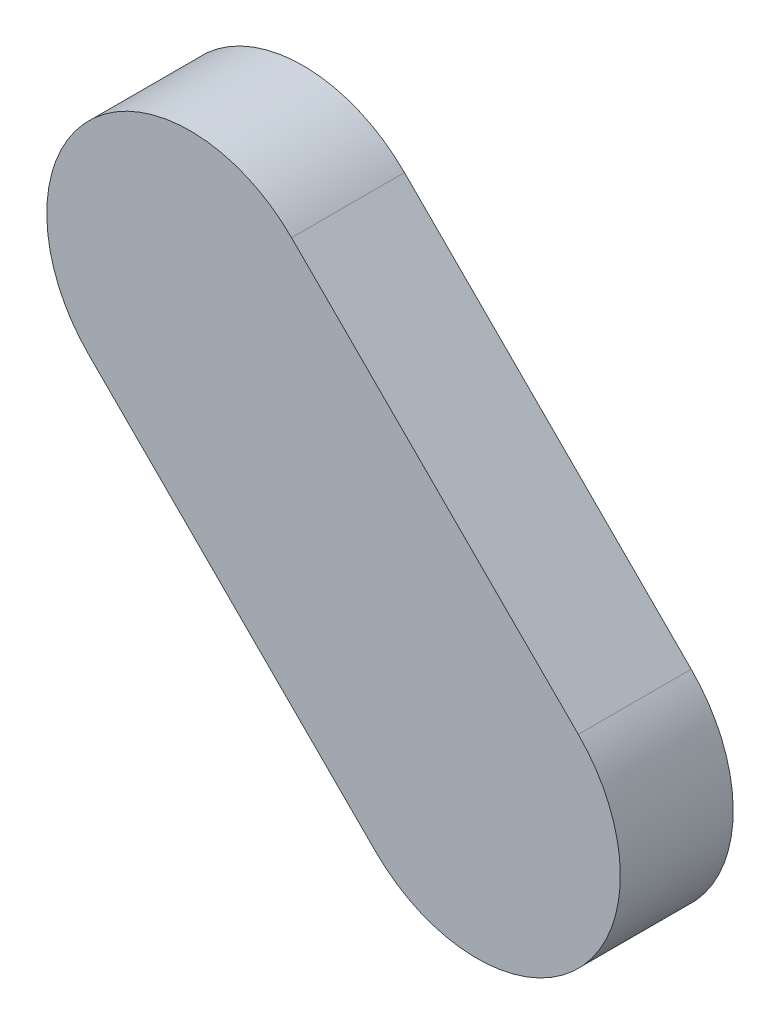
ISO-10303-21;
HEADER;
FILE_DESCRIPTION(('STEP AP214'),'2;1');
FILE_NAME('part.step','',(''),(''),'','','');
FILE_SCHEMA(('AUTOMOTIVE_DESIGN { 1 0 10303 214 1 1 1 1 }'));
ENDSEC;
DATA;
#1=APPLICATION_CONTEXT('core data for automotive mechanical design processes');
#2=APPLICATION_PROTOCOL_DEFINITION('international standard','automotive_design',2000,#1);
#3=PRODUCT_CONTEXT('',#1,'mechanical');
#4=PRODUCT('Part','Part','',(#3));
#5=PRODUCT_RELATED_PRODUCT_CATEGORY('part','',(#4));
#6=PRODUCT_DEFINITION_FORMATION('','',#4);
#7=PRODUCT_DEFINITION_CONTEXT('part definition',#1,'design');
#8=PRODUCT_DEFINITION('design','',#6,#7);
#9=PRODUCT_DEFINITION_SHAPE('','',#8);
#10=(LENGTH_UNIT() NAMED_UNIT(*) SI_UNIT(.MILLI.,.METRE.));
#11=(NAMED_UNIT(*) PLANE_ANGLE_UNIT() SI_UNIT($,.RADIAN.));
#12=(NAMED_UNIT(*) SI_UNIT($,.STERADIAN.) SOLID_ANGLE_UNIT());
#13=UNCERTAINTY_MEASURE_WITH_UNIT(LENGTH_MEASURE(1.E-05),#10,'distance_accuracy_value','');
#14=(GEOMETRIC_REPRESENTATION_CONTEXT(3) GLOBAL_UNCERTAINTY_ASSIGNED_CONTEXT((#13)) GLOBAL_UNIT_ASSIGNED_CONTEXT((#10,
#11,#12)) REPRESENTATION_CONTEXT('',''));
#15=CARTESIAN_POINT('',(0.,0.,0.));
#16=DIRECTION('',(0.,0.,1.));
#17=DIRECTION('',(1.,0.,0.));
#18=AXIS2_PLACEMENT_3D('',#15,#16,#17);
#19=CARTESIAN_POINT('',(88.2123966,65.35239406,0.));
#20=DIRECTION('',(0.707106781186548,0.707106781186548,0.));
#21=DIRECTION('',(0.707106781186548,-0.707106781186548,0.));
#22=AXIS2_PLACEMENT_3D('',#19,#20,#21);
#23=PLANE('',#22);
#24=DIRECTION('',(0.707106781186548,-0.707106781186548,0.));
#25=VECTOR('',#24,1.);
#26=CARTESIAN_POINT('',(88.2123966,65.35239406,0.1999996));
#27=LINE('',#26,#25);
#28=CARTESIAN_POINT('',(88.2123966,65.35239406,0.1999996));
#29=VERTEX_POINT('',#28);
#30=CARTESIAN_POINT('',(88.72039406,64.8443966,0.1999996));
#31=VERTEX_POINT('',#30);
#32=EDGE_CURVE('E11',#29,#31,#27,.T.);
#33=ORIENTED_EDGE('',*,*,#32,.F.);
#34=DIRECTION('',(0.,0.,1.));
#35=VECTOR('',#34,1.);
#36=CARTESIAN_POINT('',(88.2123966,65.35239406,0.));
#37=LINE('',#36,#35);
#38=CARTESIAN_POINT('',(88.2123966,65.35239406,0.));
#39=VERTEX_POINT('',#38);
#40=EDGE_CURVE('E24',#39,#29,#37,.T.);
#41=ORIENTED_EDGE('',*,*,#40,.F.);
#42=DIRECTION('',(0.707106781186548,-0.707106781186548,0.));
#43=VECTOR('',#42,1.);
#44=CARTESIAN_POINT('',(88.2123966,65.35239406,0.));
#45=LINE('',#44,#43);
#46=CARTESIAN_POINT('',(88.72039406,64.8443966,0.));
#47=VERTEX_POINT('',#46);
#48=EDGE_CURVE('E75',#39,#47,#45,.T.);
#49=ORIENTED_EDGE('',*,*,#48,.T.);
#50=DIRECTION('',(0.,0.,1.));
#51=VECTOR('',#50,1.);
#52=CARTESIAN_POINT('',(88.72039406,64.8443966,0.));
#53=LINE('',#52,#51);
#54=EDGE_CURVE('E37',#47,#31,#53,.T.);
#55=ORIENTED_EDGE('',*,*,#54,.T.);
#56=EDGE_LOOP('',(#33,#41,#49,#55));
#57=FACE_BOUND('',#56,.T.);
#58=ADVANCED_FACE('F17',(#57),#23,.F.);
#59=CARTESIAN_POINT('',(88.89999873,65.02400127,0.));
#60=DIRECTION('',(0.,0.,-1.));
#61=DIRECTION('',(-0.70710678118652,-0.707106781186576,0.));
#62=AXIS2_PLACEMENT_3D('',#59,#60,#61);
#63=CYLINDRICAL_SURFACE('',#62,0.253999360179546);
#64=CARTESIAN_POINT('',(88.89999873,65.02400127,0.1999996));
#65=DIRECTION('',(0.,0.,1.));
#66=DIRECTION('',(-0.70710678118652,-0.707106781186576,0.));
#67=AXIS2_PLACEMENT_3D('',#64,#65,#66);
#68=CIRCLE('',#67,0.253999360179546);
#69=CARTESIAN_POINT('',(89.0796034,65.20360594,0.1999996));
#70=VERTEX_POINT('',#69);
#71=EDGE_CURVE('E83',#31,#70,#68,.T.);
#72=ORIENTED_EDGE('',*,*,#71,.F.);
#73=ORIENTED_EDGE('',*,*,#54,.F.);
#74=CARTESIAN_POINT('',(88.89999873,65.02400127,0.));
#75=DIRECTION('',(0.,0.,1.));
#76=DIRECTION('',(-0.70710678118652,-0.707106781186576,0.));
#77=AXIS2_PLACEMENT_3D('',#74,#75,#76);
#78=CIRCLE('',#77,0.253999360179546);
#79=CARTESIAN_POINT('',(89.0796034,65.20360594,0.));
#80=VERTEX_POINT('',#79);
#81=EDGE_CURVE('E81',#47,#80,#78,.T.);
#82=ORIENTED_EDGE('',*,*,#81,.T.);
#83=DIRECTION('',(0.,0.,1.));
#84=VECTOR('',#83,1.);
#85=CARTESIAN_POINT('',(89.0796034,65.20360594,0.));
#86=LINE('',#85,#84);
#87=EDGE_CURVE('E67',#80,#70,#86,.T.);
#88=ORIENTED_EDGE('',*,*,#87,.T.);
#89=EDGE_LOOP('',(#72,#73,#82,#88));
#90=FACE_BOUND('',#89,.T.);
#91=ADVANCED_FACE('F89',(#90),#63,.T.);
#92=CARTESIAN_POINT('',(89.0796034,65.20360594,0.));
#93=DIRECTION('',(-0.707106781186548,-0.707106781186548,0.));
#94=DIRECTION('',(-0.707106781186548,0.707106781186548,0.));
#95=AXIS2_PLACEMENT_3D('',#92,#93,#94);
#96=PLANE('',#95);
#97=DIRECTION('',(-0.707106781186548,0.707106781186548,0.));
#98=VECTOR('',#97,1.);
#99=CARTESIAN_POINT('',(89.0796034,65.20360594,0.1999996));
#100=LINE('',#99,#98);
#101=CARTESIAN_POINT('',(88.57160594,65.7116034,0.1999996));
#102=VERTEX_POINT('',#101);
#103=EDGE_CURVE('E71',#70,#102,#100,.T.);
#104=ORIENTED_EDGE('',*,*,#103,.F.);
#105=ORIENTED_EDGE('',*,*,#87,.F.);
#106=DIRECTION('',(-0.707106781186548,0.707106781186548,0.));
#107=VECTOR('',#106,1.);
#108=CARTESIAN_POINT('',(89.0796034,65.20360594,0.));
#109=LINE('',#108,#107);
#110=CARTESIAN_POINT('',(88.57160594,65.7116034,0.));
#111=VERTEX_POINT('',#110);
#112=EDGE_CURVE('E63',#80,#111,#109,.T.);
#113=ORIENTED_EDGE('',*,*,#112,.T.);
#114=DIRECTION('',(0.,0.,1.));
#115=VECTOR('',#114,1.);
#116=CARTESIAN_POINT('',(88.57160594,65.7116034,0.));
#117=LINE('',#116,#115);
#118=EDGE_CURVE('E53',#111,#102,#117,.T.);
#119=ORIENTED_EDGE('',*,*,#118,.T.);
#120=EDGE_LOOP('',(#104,#105,#113,#119));
#121=FACE_BOUND('',#120,.T.);
#122=ADVANCED_FACE('F66',(#121),#96,.F.);
#123=CARTESIAN_POINT('',(88.39200127,65.53199873,0.));
#124=DIRECTION('',(0.,0.,-1.));
#125=DIRECTION('',(0.70710678118652,0.707106781186576,0.));
#126=AXIS2_PLACEMENT_3D('',#123,#124,#125);
#127=CYLINDRICAL_SURFACE('',#126,0.253999360179546);
#128=CARTESIAN_POINT('',(88.39200127,65.53199873,0.1999996));
#129=DIRECTION('',(0.,0.,1.));
#130=DIRECTION('',(0.70710678118652,0.707106781186576,0.));
#131=AXIS2_PLACEMENT_3D('',#128,#129,#130);
#132=CIRCLE('',#131,0.253999360179546);
#133=EDGE_CURVE('E59',#102,#29,#132,.T.);
#134=ORIENTED_EDGE('',*,*,#133,.F.);
#135=ORIENTED_EDGE('',*,*,#118,.F.);
#136=CARTESIAN_POINT('',(88.39200127,65.53199873,0.));
#137=DIRECTION('',(0.,0.,1.));
#138=DIRECTION('',(0.70710678118652,0.707106781186576,0.));
#139=AXIS2_PLACEMENT_3D('',#136,#137,#138);
#140=CIRCLE('',#139,0.253999360179546);
#141=EDGE_CURVE('E57',#111,#39,#140,.T.);
#142=ORIENTED_EDGE('',*,*,#141,.T.);
#143=ORIENTED_EDGE('',*,*,#40,.T.);
#144=EDGE_LOOP('',(#134,#135,#142,#143));
#145=FACE_BOUND('',#144,.T.);
#146=ADVANCED_FACE('F55',(#145),#127,.T.);
#147=CARTESIAN_POINT('',(88.2123966,65.35239406,0.));
#148=DIRECTION('',(0.,0.,-1.));
#149=DIRECTION('',(-1.,0.,0.));
#150=AXIS2_PLACEMENT_3D('',#147,#148,#149);
#151=PLANE('',#150);
#152=ORIENTED_EDGE('',*,*,#141,.F.);
#153=ORIENTED_EDGE('',*,*,#112,.F.);
#154=ORIENTED_EDGE('',*,*,#81,.F.);
#155=ORIENTED_EDGE('',*,*,#48,.F.);
#156=EDGE_LOOP('',(#152,#153,#154,#155));
#157=FACE_BOUND('',#156,.T.);
#158=ADVANCED_FACE('F74',(#157),#151,.T.);
#159=CARTESIAN_POINT('',(88.2123966,65.35239406,0.1999996));
#160=DIRECTION('',(0.,0.,-1.));
#161=DIRECTION('',(-1.,0.,0.));
#162=AXIS2_PLACEMENT_3D('',#159,#160,#161);
#163=PLANE('',#162);
#164=ORIENTED_EDGE('',*,*,#32,.T.);
#165=ORIENTED_EDGE('',*,*,#71,.T.);
#166=ORIENTED_EDGE('',*,*,#103,.T.);
#167=ORIENTED_EDGE('',*,*,#133,.T.);
#168=EDGE_LOOP('',(#164,#165,#166,#167));
#169=FACE_BOUND('',#168,.T.);
#170=ADVANCED_FACE('F91',(#169),#163,.F.);
#171=CLOSED_SHELL('',(#58,#91,#122,#146,#158,#170));
#172=MANIFOLD_SOLID_BREP('B1',#171);
#173=ADVANCED_BREP_SHAPE_REPRESENTATION('',(#18,#172),#14);
#174=SHAPE_DEFINITION_REPRESENTATION(#9,#173);
ENDSEC;
END-ISO-10303-21;
